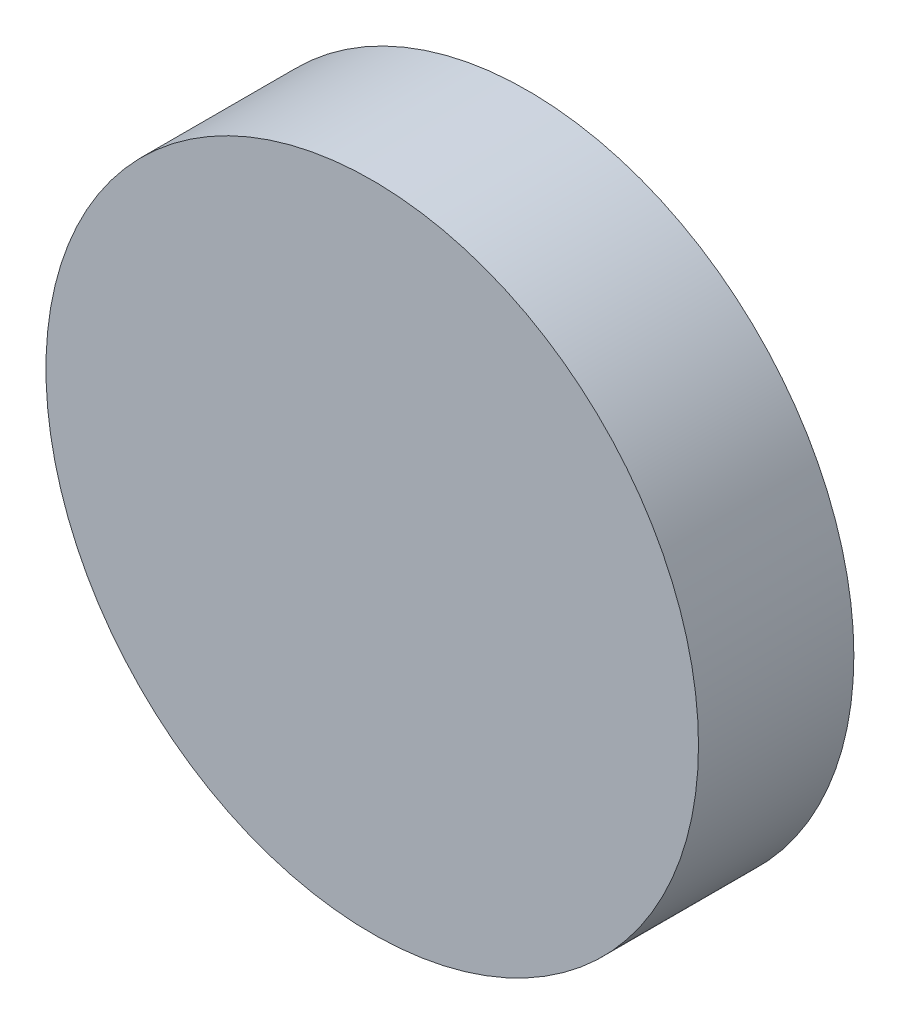
ISO-10303-21;
HEADER;
FILE_DESCRIPTION(('STEP AP214'),'2;1');
FILE_NAME('part.step','',(''),(''),'','','');
FILE_SCHEMA(('AUTOMOTIVE_DESIGN { 1 0 10303 214 1 1 1 1 }'));
ENDSEC;
DATA;
#1=APPLICATION_CONTEXT('core data for automotive mechanical design processes');
#2=APPLICATION_PROTOCOL_DEFINITION('international standard','automotive_design',2000,#1);
#3=PRODUCT_CONTEXT('',#1,'mechanical');
#4=PRODUCT('Part','Part','',(#3));
#5=PRODUCT_RELATED_PRODUCT_CATEGORY('part','',(#4));
#6=PRODUCT_DEFINITION_FORMATION('','',#4);
#7=PRODUCT_DEFINITION_CONTEXT('part definition',#1,'design');
#8=PRODUCT_DEFINITION('design','',#6,#7);
#9=PRODUCT_DEFINITION_SHAPE('','',#8);
#10=(LENGTH_UNIT() NAMED_UNIT(*) SI_UNIT(.MILLI.,.METRE.));
#11=(NAMED_UNIT(*) PLANE_ANGLE_UNIT() SI_UNIT($,.RADIAN.));
#12=(NAMED_UNIT(*) SI_UNIT($,.STERADIAN.) SOLID_ANGLE_UNIT());
#13=UNCERTAINTY_MEASURE_WITH_UNIT(LENGTH_MEASURE(1.E-05),#10,'distance_accuracy_value','');
#14=(GEOMETRIC_REPRESENTATION_CONTEXT(3) GLOBAL_UNCERTAINTY_ASSIGNED_CONTEXT((#13)) GLOBAL_UNIT_ASSIGNED_CONTEXT((#10,
#11,#12)) REPRESENTATION_CONTEXT('',''));
#15=CARTESIAN_POINT('',(0.,0.,0.));
#16=DIRECTION('',(0.,0.,1.));
#17=DIRECTION('',(1.,0.,0.));
#18=AXIS2_PLACEMENT_3D('',#15,#16,#17);
#19=CARTESIAN_POINT('',(0.,0.,10.));
#20=DIRECTION('',(0.,0.,-1.));
#21=DIRECTION('',(-1.,0.,0.));
#22=AXIS2_PLACEMENT_3D('',#19,#20,#21);
#23=CYLINDRICAL_SURFACE('',#22,21.);
#24=CARTESIAN_POINT('',(0.,0.,10.));
#25=DIRECTION('',(0.,0.,1.));
#26=DIRECTION('',(1.,0.,0.));
#27=AXIS2_PLACEMENT_3D('',#24,#25,#26);
#28=CIRCLE('',#27,21.);
#29=CARTESIAN_POINT('',(21.,0.,10.));
#30=VERTEX_POINT('',#29);
#31=EDGE_CURVE('E10',#30,#30,#28,.T.);
#32=ORIENTED_EDGE('',*,*,#31,.F.);
#33=EDGE_LOOP('',(#32));
#34=FACE_BOUND('',#33,.T.);
#35=CARTESIAN_POINT('',(0.,0.,0.));
#36=DIRECTION('',(0.,0.,1.));
#37=DIRECTION('',(1.,0.,0.));
#38=AXIS2_PLACEMENT_3D('',#35,#36,#37);
#39=CIRCLE('',#38,21.);
#40=CARTESIAN_POINT('',(21.,0.,0.));
#41=VERTEX_POINT('',#40);
#42=EDGE_CURVE('E34',#41,#41,#39,.T.);
#43=ORIENTED_EDGE('',*,*,#42,.T.);
#44=EDGE_LOOP('',(#43));
#45=FACE_BOUND('',#44,.T.);
#46=ADVANCED_FACE('F31',(#34,#45),#23,.T.);
#47=CARTESIAN_POINT('',(0.,0.,10.));
#48=DIRECTION('',(0.,0.,1.));
#49=DIRECTION('',(1.,0.,0.));
#50=AXIS2_PLACEMENT_3D('',#47,#48,#49);
#51=PLANE('',#50);
#52=ORIENTED_EDGE('',*,*,#31,.T.);
#53=EDGE_LOOP('',(#52));
#54=FACE_BOUND('',#53,.T.);
#55=ADVANCED_FACE('F46',(#54),#51,.T.);
#56=CARTESIAN_POINT('',(0.,0.,0.));
#57=DIRECTION('',(0.,0.,1.));
#58=DIRECTION('',(1.,0.,0.));
#59=AXIS2_PLACEMENT_3D('',#56,#57,#58);
#60=PLANE('',#59);
#61=ORIENTED_EDGE('',*,*,#42,.F.);
#62=EDGE_LOOP('',(#61));
#63=FACE_BOUND('',#62,.T.);
#64=ADVANCED_FACE('F44',(#63),#60,.F.);
#65=CLOSED_SHELL('',(#46,#55,#64));
#66=MANIFOLD_SOLID_BREP('B2',#65);
#67=ADVANCED_BREP_SHAPE_REPRESENTATION('',(#18,#66),#14);
#68=SHAPE_DEFINITION_REPRESENTATION(#9,#67);
ENDSEC;
END-ISO-10303-21;
